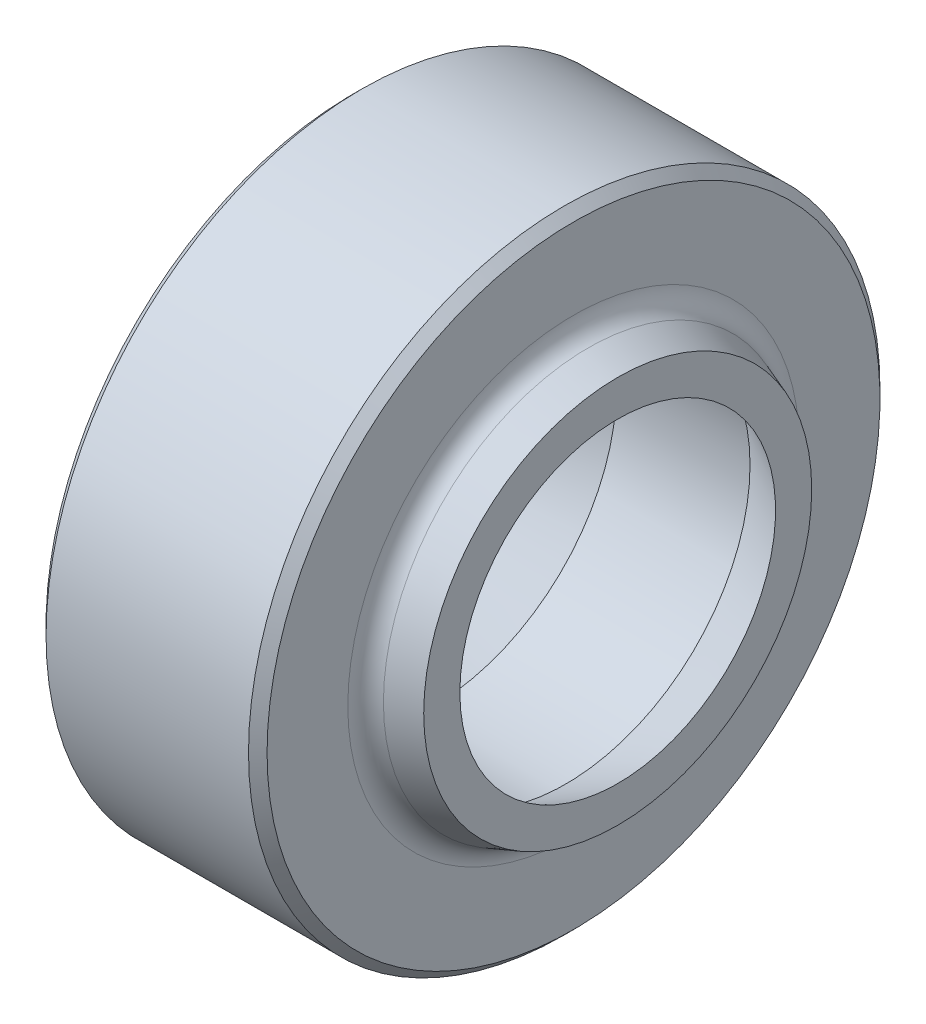
ISO-10303-21;
HEADER;
FILE_DESCRIPTION(('STEP AP214'),'2;1');
FILE_NAME('part.step','',(''),(''),'','','');
FILE_SCHEMA(('AUTOMOTIVE_DESIGN { 1 0 10303 214 1 1 1 1 }'));
ENDSEC;
DATA;
#1=APPLICATION_CONTEXT('core data for automotive mechanical design processes');
#2=APPLICATION_PROTOCOL_DEFINITION('international standard','automotive_design',2000,#1);
#3=PRODUCT_CONTEXT('',#1,'mechanical');
#4=PRODUCT('Part','Part','',(#3));
#5=PRODUCT_RELATED_PRODUCT_CATEGORY('part','',(#4));
#6=PRODUCT_DEFINITION_FORMATION('','',#4);
#7=PRODUCT_DEFINITION_CONTEXT('part definition',#1,'design');
#8=PRODUCT_DEFINITION('design','',#6,#7);
#9=PRODUCT_DEFINITION_SHAPE('','',#8);
#10=(LENGTH_UNIT() NAMED_UNIT(*) SI_UNIT(.MILLI.,.METRE.));
#11=(NAMED_UNIT(*) PLANE_ANGLE_UNIT() SI_UNIT($,.RADIAN.));
#12=(NAMED_UNIT(*) SI_UNIT($,.STERADIAN.) SOLID_ANGLE_UNIT());
#13=UNCERTAINTY_MEASURE_WITH_UNIT(LENGTH_MEASURE(1.E-05),#10,'distance_accuracy_value','');
#14=(GEOMETRIC_REPRESENTATION_CONTEXT(3) GLOBAL_UNCERTAINTY_ASSIGNED_CONTEXT((#13)) GLOBAL_UNIT_ASSIGNED_CONTEXT((#10,
#11,#12)) REPRESENTATION_CONTEXT('',''));
#15=CARTESIAN_POINT('',(0.,0.,0.));
#16=DIRECTION('',(0.,0.,1.));
#17=DIRECTION('',(1.,0.,0.));
#18=AXIS2_PLACEMENT_3D('',#15,#16,#17);
#19=CARTESIAN_POINT('',(0.,4.42763716970224,0.));
#20=DIRECTION('',(1.,0.,0.));
#21=DIRECTION('',(0.,0.,-1.));
#22=AXIS2_PLACEMENT_3D('',#19,#20,#21);
#23=PLANE('',#22);
#24=CARTESIAN_POINT('',(0.,0.,0.));
#25=DIRECTION('',(1.,0.,0.));
#26=DIRECTION('',(0.,0.,-1.));
#27=AXIS2_PLACEMENT_3D('',#24,#25,#26);
#28=CIRCLE('',#27,4.853);
#29=CARTESIAN_POINT('',(0.,0.,-4.853));
#30=VERTEX_POINT('',#29);
#31=EDGE_CURVE('E37',#30,#30,#28,.F.);
#32=ORIENTED_EDGE('',*,*,#31,.T.);
#33=EDGE_LOOP('',(#32));
#34=FACE_BOUND('',#33,.T.);
#35=CARTESIAN_POINT('',(0.,0.,0.));
#36=DIRECTION('',(-1.,0.,0.));
#37=DIRECTION('',(0.,0.,1.));
#38=AXIS2_PLACEMENT_3D('',#35,#36,#37);
#39=CIRCLE('',#38,4.42763716970224);
#40=CARTESIAN_POINT('',(0.,0.,4.42763716970224));
#41=VERTEX_POINT('',#40);
#42=EDGE_CURVE('E79',#41,#41,#39,.T.);
#43=ORIENTED_EDGE('',*,*,#42,.F.);
#44=EDGE_LOOP('',(#43));
#45=FACE_BOUND('',#44,.T.);
#46=ADVANCED_FACE('F27',(#34,#45),#23,.F.);
#47=CARTESIAN_POINT('',(0.,0.,0.));
#48=DIRECTION('',(-1.,0.,0.));
#49=DIRECTION('',(0.,0.,1.));
#50=AXIS2_PLACEMENT_3D('',#47,#48,#49);
#51=CYLINDRICAL_SURFACE('',#50,5.);
#52=CARTESIAN_POINT('',(3.353,0.,0.));
#53=DIRECTION('',(-1.,0.,0.));
#54=DIRECTION('',(0.,0.,1.));
#55=AXIS2_PLACEMENT_3D('',#52,#53,#54);
#56=CIRCLE('',#55,5.);
#57=CARTESIAN_POINT('',(3.353,0.,5.));
#58=VERTEX_POINT('',#57);
#59=EDGE_CURVE('E46',#58,#58,#56,.T.);
#60=ORIENTED_EDGE('',*,*,#59,.T.);
#61=EDGE_LOOP('',(#60));
#62=FACE_BOUND('',#61,.T.);
#63=CARTESIAN_POINT('',(0.147,0.,0.));
#64=DIRECTION('',(1.,0.,0.));
#65=DIRECTION('',(0.,0.,-1.));
#66=AXIS2_PLACEMENT_3D('',#63,#64,#65);
#67=CIRCLE('',#66,5.);
#68=CARTESIAN_POINT('',(0.147,0.,-5.));
#69=VERTEX_POINT('',#68);
#70=EDGE_CURVE('E49',#69,#69,#67,.T.);
#71=ORIENTED_EDGE('',*,*,#70,.T.);
#72=EDGE_LOOP('',(#71));
#73=FACE_BOUND('',#72,.T.);
#74=ADVANCED_FACE('F86',(#62,#73),#51,.T.);
#75=CARTESIAN_POINT('',(3.5,5.,0.));
#76=DIRECTION('',(-1.,0.,0.));
#77=DIRECTION('',(0.,0.,1.));
#78=AXIS2_PLACEMENT_3D('',#75,#76,#77);
#79=PLANE('',#78);
#80=CARTESIAN_POINT('',(3.5,0.,0.));
#81=DIRECTION('',(-1.,0.,0.));
#82=DIRECTION('',(0.,0.,1.));
#83=AXIS2_PLACEMENT_3D('',#80,#81,#82);
#84=CIRCLE('',#83,3.57417521376448);
#85=CARTESIAN_POINT('',(3.5,0.,3.57417521376448));
#86=VERTEX_POINT('',#85);
#87=EDGE_CURVE('E33',#86,#86,#84,.T.);
#88=ORIENTED_EDGE('',*,*,#87,.T.);
#89=EDGE_LOOP('',(#88));
#90=FACE_BOUND('',#89,.T.);
#91=CARTESIAN_POINT('',(3.5,0.,0.));
#92=DIRECTION('',(-1.,0.,0.));
#93=DIRECTION('',(0.,0.,1.));
#94=AXIS2_PLACEMENT_3D('',#91,#92,#93);
#95=CIRCLE('',#94,4.853);
#96=CARTESIAN_POINT('',(3.5,0.,4.853));
#97=VERTEX_POINT('',#96);
#98=EDGE_CURVE('E41',#97,#97,#95,.F.);
#99=ORIENTED_EDGE('',*,*,#98,.T.);
#100=EDGE_LOOP('',(#99));
#101=FACE_BOUND('',#100,.T.);
#102=ADVANCED_FACE('F92',(#90,#101),#79,.F.);
#103=CARTESIAN_POINT('',(4.2,0.,0.));
#104=DIRECTION('',(-1.,0.,0.));
#105=DIRECTION('',(0.,0.,1.));
#106=AXIS2_PLACEMENT_3D('',#103,#104,#105);
#107=CONICAL_SURFACE('',#106,3.07236283029775,0.349065850398863);
#108=CARTESIAN_POINT('',(3.7321352934347,0.,0.));
#109=DIRECTION('',(-1.,0.,0.));
#110=DIRECTION('',(0.,0.,1.));
#111=AXIS2_PLACEMENT_3D('',#108,#109,#110);
#112=CIRCLE('',#111,3.24265165715121);
#113=CARTESIAN_POINT('',(3.7321352934347,0.,3.24265165715121));
#114=VERTEX_POINT('',#113);
#115=EDGE_CURVE('E10',#114,#114,#112,.F.);
#116=ORIENTED_EDGE('',*,*,#115,.T.);
#117=EDGE_LOOP('',(#116));
#118=FACE_BOUND('',#117,.T.);
#119=CARTESIAN_POINT('',(4.2,0.,0.));
#120=DIRECTION('',(-1.,0.,0.));
#121=DIRECTION('',(0.,0.,1.));
#122=AXIS2_PLACEMENT_3D('',#119,#120,#121);
#123=CIRCLE('',#122,3.07236283029775);
#124=CARTESIAN_POINT('',(4.2,0.,3.07236283029775));
#125=VERTEX_POINT('',#124);
#126=EDGE_CURVE('E58',#125,#125,#123,.T.);
#127=ORIENTED_EDGE('',*,*,#126,.T.);
#128=EDGE_LOOP('',(#127));
#129=FACE_BOUND('',#128,.T.);
#130=ADVANCED_FACE('F146',(#118,#129),#107,.T.);
#131=CARTESIAN_POINT('',(4.2,3.07236283029775,0.));
#132=DIRECTION('',(-1.,0.,0.));
#133=DIRECTION('',(0.,0.,1.));
#134=AXIS2_PLACEMENT_3D('',#131,#132,#133);
#135=PLANE('',#134);
#136=ORIENTED_EDGE('',*,*,#126,.F.);
#137=EDGE_LOOP('',(#136));
#138=FACE_BOUND('',#137,.T.);
#139=CARTESIAN_POINT('',(4.2,0.,0.));
#140=DIRECTION('',(-1.,0.,0.));
#141=DIRECTION('',(0.,0.,1.));
#142=AXIS2_PLACEMENT_3D('',#139,#140,#141);
#143=CIRCLE('',#142,2.5);
#144=CARTESIAN_POINT('',(4.2,0.,2.5));
#145=VERTEX_POINT('',#144);
#146=EDGE_CURVE('E61',#145,#145,#143,.T.);
#147=ORIENTED_EDGE('',*,*,#146,.T.);
#148=EDGE_LOOP('',(#147));
#149=FACE_BOUND('',#148,.T.);
#150=ADVANCED_FACE('F142',(#138,#149),#135,.F.);
#151=CARTESIAN_POINT('',(3.37570358768782,0.,0.));
#152=DIRECTION('',(-1.,0.,0.));
#153=DIRECTION('',(0.,0.,1.));
#154=AXIS2_PLACEMENT_3D('',#151,#152,#153);
#155=CONICAL_SURFACE('',#154,2.92,0.471238898038459);
#156=ORIENTED_EDGE('',*,*,#146,.F.);
#157=EDGE_LOOP('',(#156));
#158=FACE_BOUND('',#157,.T.);
#159=CARTESIAN_POINT('',(3.37570358768782,0.,0.));
#160=DIRECTION('',(-1.,0.,0.));
#161=DIRECTION('',(0.,0.,1.));
#162=AXIS2_PLACEMENT_3D('',#159,#160,#161);
#163=CIRCLE('',#162,2.92);
#164=CARTESIAN_POINT('',(3.37570358768782,0.,2.92));
#165=VERTEX_POINT('',#164);
#166=EDGE_CURVE('E64',#165,#165,#163,.T.);
#167=ORIENTED_EDGE('',*,*,#166,.T.);
#168=EDGE_LOOP('',(#167));
#169=FACE_BOUND('',#168,.T.);
#170=ADVANCED_FACE('F138',(#158,#169),#155,.F.);
#171=CARTESIAN_POINT('',(0.,0.,0.));
#172=DIRECTION('',(-1.,0.,0.));
#173=DIRECTION('',(0.,0.,1.));
#174=AXIS2_PLACEMENT_3D('',#171,#172,#173);
#175=CYLINDRICAL_SURFACE('',#174,2.92);
#176=ORIENTED_EDGE('',*,*,#166,.F.);
#177=EDGE_LOOP('',(#176));
#178=FACE_BOUND('',#177,.T.);
#179=CARTESIAN_POINT('',(1.26,0.,0.));
#180=DIRECTION('',(-1.,0.,0.));
#181=DIRECTION('',(0.,0.,1.));
#182=AXIS2_PLACEMENT_3D('',#179,#180,#181);
#183=CIRCLE('',#182,2.92);
#184=CARTESIAN_POINT('',(1.26,0.,2.92));
#185=VERTEX_POINT('',#184);
#186=EDGE_CURVE('E67',#185,#185,#183,.T.);
#187=ORIENTED_EDGE('',*,*,#186,.T.);
#188=EDGE_LOOP('',(#187));
#189=FACE_BOUND('',#188,.T.);
#190=ADVANCED_FACE('F134',(#178,#189),#175,.F.);
#191=CARTESIAN_POINT('',(0.42,0.,0.));
#192=DIRECTION('',(1.,0.,0.));
#193=DIRECTION('',(0.,0.,-1.));
#194=AXIS2_PLACEMENT_3D('',#191,#192,#193);
#195=CONICAL_SURFACE('',#194,2.5,0.463647609000806);
#196=ORIENTED_EDGE('',*,*,#186,.F.);
#197=EDGE_LOOP('',(#196));
#198=FACE_BOUND('',#197,.T.);
#199=CARTESIAN_POINT('',(0.42,0.,0.));
#200=DIRECTION('',(-1.,0.,0.));
#201=DIRECTION('',(0.,0.,1.));
#202=AXIS2_PLACEMENT_3D('',#199,#200,#201);
#203=CIRCLE('',#202,2.5);
#204=CARTESIAN_POINT('',(0.42,0.,2.5));
#205=VERTEX_POINT('',#204);
#206=EDGE_CURVE('E70',#205,#205,#203,.T.);
#207=ORIENTED_EDGE('',*,*,#206,.T.);
#208=EDGE_LOOP('',(#207));
#209=FACE_BOUND('',#208,.T.);
#210=ADVANCED_FACE('F130',(#198,#209),#195,.F.);
#211=CARTESIAN_POINT('',(0.168,0.,0.));
#212=DIRECTION('',(-1.,0.,0.));
#213=DIRECTION('',(0.,0.,1.));
#214=AXIS2_PLACEMENT_3D('',#211,#212,#213);
#215=CONICAL_SURFACE('',#214,2.752,0.785398163397449);
#216=ORIENTED_EDGE('',*,*,#206,.F.);
#217=EDGE_LOOP('',(#216));
#218=FACE_BOUND('',#217,.T.);
#219=CARTESIAN_POINT('',(0.168,0.,0.));
#220=DIRECTION('',(-1.,0.,0.));
#221=DIRECTION('',(0.,0.,1.));
#222=AXIS2_PLACEMENT_3D('',#219,#220,#221);
#223=CIRCLE('',#222,2.752);
#224=CARTESIAN_POINT('',(0.168,0.,2.752));
#225=VERTEX_POINT('',#224);
#226=EDGE_CURVE('E73',#225,#225,#223,.T.);
#227=ORIENTED_EDGE('',*,*,#226,.T.);
#228=EDGE_LOOP('',(#227));
#229=FACE_BOUND('',#228,.T.);
#230=ADVANCED_FACE('F126',(#218,#229),#215,.F.);
#231=CARTESIAN_POINT('',(0.168,3.22222306935211,0.));
#232=DIRECTION('',(1.,0.,0.));
#233=DIRECTION('',(0.,0.,-1.));
#234=AXIS2_PLACEMENT_3D('',#231,#232,#233);
#235=PLANE('',#234);
#236=ORIENTED_EDGE('',*,*,#226,.F.);
#237=EDGE_LOOP('',(#236));
#238=FACE_BOUND('',#237,.T.);
#239=CARTESIAN_POINT('',(0.168,0.,0.));
#240=DIRECTION('',(-1.,0.,0.));
#241=DIRECTION('',(0.,0.,1.));
#242=AXIS2_PLACEMENT_3D('',#239,#240,#241);
#243=CIRCLE('',#242,3.22222306935211);
#244=CARTESIAN_POINT('',(0.168,0.,3.22222306935211));
#245=VERTEX_POINT('',#244);
#246=EDGE_CURVE('E76',#245,#245,#243,.T.);
#247=ORIENTED_EDGE('',*,*,#246,.T.);
#248=EDGE_LOOP('',(#247));
#249=FACE_BOUND('',#248,.T.);
#250=ADVANCED_FACE('F122',(#238,#249),#235,.F.);
#251=CARTESIAN_POINT('',(2.33333333333333,0.,0.));
#252=DIRECTION('',(1.,0.,0.));
#253=DIRECTION('',(0.,0.,-1.));
#254=AXIS2_PLACEMENT_3D('',#251,#252,#253);
#255=CONICAL_SURFACE('',#254,3.80242238736296,0.261799387799147);
#256=CARTESIAN_POINT('',(1.27349736087752,0.,0.));
#257=DIRECTION('',(1.,0.,0.));
#258=DIRECTION('',(0.,0.,-1.));
#259=AXIS2_PLACEMENT_3D('',#256,#257,#258);
#260=CIRCLE('',#259,3.51844019443398);
#261=CARTESIAN_POINT('',(1.27349736087752,0.,-3.51844019443398));
#262=VERTEX_POINT('',#261);
#263=EDGE_CURVE('E55',#262,#262,#260,.F.);
#264=ORIENTED_EDGE('',*,*,#263,.T.);
#265=EDGE_LOOP('',(#264));
#266=FACE_BOUND('',#265,.T.);
#267=ORIENTED_EDGE('',*,*,#246,.F.);
#268=EDGE_LOOP('',(#267));
#269=FACE_BOUND('',#268,.T.);
#270=ADVANCED_FACE('F118',(#266,#269),#255,.T.);
#271=CARTESIAN_POINT('',(0.,0.,0.));
#272=DIRECTION('',(-1.,0.,0.));
#273=DIRECTION('',(0.,0.,1.));
#274=AXIS2_PLACEMENT_3D('',#271,#272,#273);
#275=CONICAL_SURFACE('',#274,4.42763716970224,0.261799387799147);
#276=CARTESIAN_POINT('',(1.27349736087752,0.,0.));
#277=DIRECTION('',(-1.,0.,0.));
#278=DIRECTION('',(0.,0.,1.));
#279=AXIS2_PLACEMENT_3D('',#276,#277,#278);
#280=CIRCLE('',#279,4.08640458029195);
#281=CARTESIAN_POINT('',(1.27349736087752,0.,4.08640458029195));
#282=VERTEX_POINT('',#281);
#283=EDGE_CURVE('E52',#282,#282,#280,.F.);
#284=ORIENTED_EDGE('',*,*,#283,.T.);
#285=EDGE_LOOP('',(#284));
#286=FACE_BOUND('',#285,.T.);
#287=ORIENTED_EDGE('',*,*,#42,.T.);
#288=EDGE_LOOP('',(#287));
#289=FACE_BOUND('',#288,.T.);
#290=ADVANCED_FACE('F83',(#286,#289),#275,.F.);
#291=CARTESIAN_POINT('',(1.19740456161738,0.,0.));
#292=DIRECTION('',(-1.,0.,0.));
#293=DIRECTION('',(0.,0.,1.));
#294=AXIS2_PLACEMENT_3D('',#291,#292,#293);
#295=TOROIDAL_SURFACE('',#294,3.80242238736296,0.294);
#296=ORIENTED_EDGE('',*,*,#283,.F.);
#297=EDGE_LOOP('',(#296));
#298=FACE_BOUND('',#297,.T.);
#299=ORIENTED_EDGE('',*,*,#263,.F.);
#300=EDGE_LOOP('',(#299));
#301=FACE_BOUND('',#300,.T.);
#302=ADVANCED_FACE('F109',(#298,#301),#295,.F.);
#303=CARTESIAN_POINT('',(3.353,0.,0.));
#304=DIRECTION('',(-1.,0.,0.));
#305=DIRECTION('',(0.,0.,1.));
#306=AXIS2_PLACEMENT_3D('',#303,#304,#305);
#307=CONICAL_SURFACE('',#306,5.,0.785398163397451);
#308=ORIENTED_EDGE('',*,*,#98,.F.);
#309=EDGE_LOOP('',(#308));
#310=FACE_BOUND('',#309,.T.);
#311=ORIENTED_EDGE('',*,*,#59,.F.);
#312=EDGE_LOOP('',(#311));
#313=FACE_BOUND('',#312,.T.);
#314=ADVANCED_FACE('F99',(#310,#313),#307,.T.);
#315=CARTESIAN_POINT('',(0.,0.,0.));
#316=DIRECTION('',(1.,0.,0.));
#317=DIRECTION('',(0.,0.,-1.));
#318=AXIS2_PLACEMENT_3D('',#315,#316,#317);
#319=CONICAL_SURFACE('',#318,4.853,0.785398163397442);
#320=ORIENTED_EDGE('',*,*,#70,.F.);
#321=EDGE_LOOP('',(#320));
#322=FACE_BOUND('',#321,.T.);
#323=ORIENTED_EDGE('',*,*,#31,.F.);
#324=EDGE_LOOP('',(#323));
#325=FACE_BOUND('',#324,.T.);
#326=ADVANCED_FACE('F96',(#322,#325),#319,.T.);
#327=CARTESIAN_POINT('',(3.8528,0.,0.));
#328=DIRECTION('',(-1.,0.,0.));
#329=DIRECTION('',(0.,0.,1.));
#330=AXIS2_PLACEMENT_3D('',#327,#328,#329);
#331=TOROIDAL_SURFACE('',#330,3.57417521376448,0.3528);
#332=ORIENTED_EDGE('',*,*,#115,.F.);
#333=EDGE_LOOP('',(#332));
#334=FACE_BOUND('',#333,.T.);
#335=ORIENTED_EDGE('',*,*,#87,.F.);
#336=EDGE_LOOP('',(#335));
#337=FACE_BOUND('',#336,.T.);
#338=ADVANCED_FACE('F98',(#334,#337),#331,.F.);
#339=CLOSED_SHELL('',(#46,#74,#102,#130,#150,#170,#190,#210,#230,#250,#270,#290,#302,#314,#326,#338));
#340=MANIFOLD_SOLID_BREP('B2',#339);
#341=ADVANCED_BREP_SHAPE_REPRESENTATION('',(#18,#340),#14);
#342=SHAPE_DEFINITION_REPRESENTATION(#9,#341);
ENDSEC;
END-ISO-10303-21;
